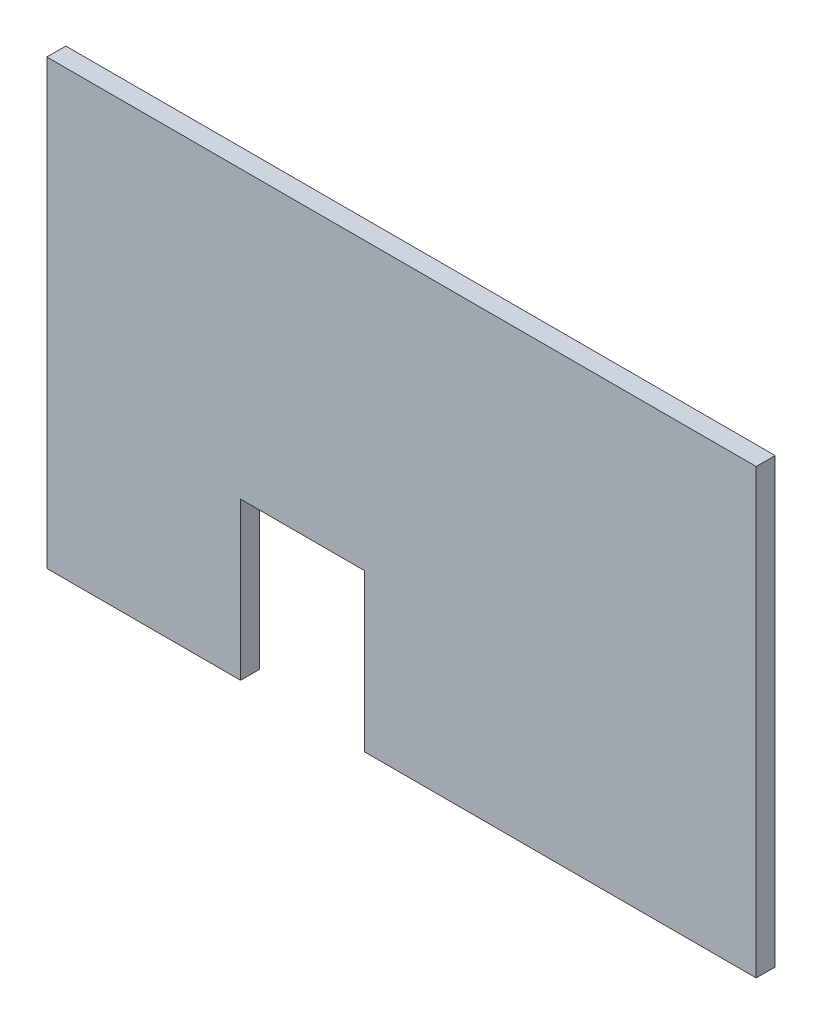
ISO-10303-21;
HEADER;
FILE_DESCRIPTION(('STEP AP214'),'2;1');
FILE_NAME('part.step','',(''),(''),'','','');
FILE_SCHEMA(('AUTOMOTIVE_DESIGN { 1 0 10303 214 1 1 1 1 }'));
ENDSEC;
DATA;
#1=APPLICATION_CONTEXT('core data for automotive mechanical design processes');
#2=APPLICATION_PROTOCOL_DEFINITION('international standard','automotive_design',2000,#1);
#3=PRODUCT_CONTEXT('',#1,'mechanical');
#4=PRODUCT('Part','Part','',(#3));
#5=PRODUCT_RELATED_PRODUCT_CATEGORY('part','',(#4));
#6=PRODUCT_DEFINITION_FORMATION('','',#4);
#7=PRODUCT_DEFINITION_CONTEXT('part definition',#1,'design');
#8=PRODUCT_DEFINITION('design','',#6,#7);
#9=PRODUCT_DEFINITION_SHAPE('','',#8);
#10=(LENGTH_UNIT() NAMED_UNIT(*) SI_UNIT(.MILLI.,.METRE.));
#11=(NAMED_UNIT(*) PLANE_ANGLE_UNIT() SI_UNIT($,.RADIAN.));
#12=(NAMED_UNIT(*) SI_UNIT($,.STERADIAN.) SOLID_ANGLE_UNIT());
#13=UNCERTAINTY_MEASURE_WITH_UNIT(LENGTH_MEASURE(1.E-05),#10,'distance_accuracy_value','');
#14=(GEOMETRIC_REPRESENTATION_CONTEXT(3) GLOBAL_UNCERTAINTY_ASSIGNED_CONTEXT((#13)) GLOBAL_UNIT_ASSIGNED_CONTEXT((#10,
#11,#12)) REPRESENTATION_CONTEXT('',''));
#15=CARTESIAN_POINT('',(0.,0.,0.));
#16=DIRECTION('',(0.,0.,1.));
#17=DIRECTION('',(1.,0.,0.));
#18=AXIS2_PLACEMENT_3D('',#15,#16,#17);
#19=CARTESIAN_POINT('',(67.55,35.,-153.));
#20=DIRECTION('',(-1.,0.,0.));
#21=DIRECTION('',(0.,0.,1.));
#22=AXIS2_PLACEMENT_3D('',#19,#20,#21);
#23=PLANE('',#22);
#24=DIRECTION('',(0.,-1.,0.));
#25=VECTOR('',#24,1.);
#26=CARTESIAN_POINT('',(67.55,35.,-150.));
#27=LINE('',#26,#25);
#28=CARTESIAN_POINT('',(67.55,35.,-150.));
#29=VERTEX_POINT('',#28);
#30=CARTESIAN_POINT('',(67.55,-35.,-150.));
#31=VERTEX_POINT('',#30);
#32=EDGE_CURVE('E129',#29,#31,#27,.T.);
#33=ORIENTED_EDGE('',*,*,#32,.T.);
#34=DIRECTION('',(0.,0.,1.));
#35=VECTOR('',#34,1.);
#36=CARTESIAN_POINT('',(67.55,-35.,-153.));
#37=LINE('',#36,#35);
#38=CARTESIAN_POINT('',(67.55,-35.,-153.));
#39=VERTEX_POINT('',#38);
#40=EDGE_CURVE('E11',#39,#31,#37,.T.);
#41=ORIENTED_EDGE('',*,*,#40,.F.);
#42=DIRECTION('',(0.,-1.,0.));
#43=VECTOR('',#42,1.);
#44=CARTESIAN_POINT('',(67.55,35.,-153.));
#45=LINE('',#44,#43);
#46=CARTESIAN_POINT('',(67.55,35.,-153.));
#47=VERTEX_POINT('',#46);
#48=EDGE_CURVE('E143',#47,#39,#45,.T.);
#49=ORIENTED_EDGE('',*,*,#48,.F.);
#50=DIRECTION('',(0.,0.,1.));
#51=VECTOR('',#50,1.);
#52=CARTESIAN_POINT('',(67.55,35.,-153.));
#53=LINE('',#52,#51);
#54=EDGE_CURVE('E125',#47,#29,#53,.T.);
#55=ORIENTED_EDGE('',*,*,#54,.T.);
#56=EDGE_LOOP('',(#33,#41,#49,#55));
#57=FACE_BOUND('',#56,.T.);
#58=ADVANCED_FACE('F33',(#57),#23,.F.);
#59=CARTESIAN_POINT('',(67.55,-35.,-153.));
#60=DIRECTION('',(0.,1.,0.));
#61=DIRECTION('',(0.,0.,1.));
#62=AXIS2_PLACEMENT_3D('',#59,#60,#61);
#63=PLANE('',#62);
#64=DIRECTION('',(-1.,0.,0.));
#65=VECTOR('',#64,1.);
#66=CARTESIAN_POINT('',(67.55,-35.,-150.));
#67=LINE('',#66,#65);
#68=CARTESIAN_POINT('',(5.67558189881321,-35.,-150.));
#69=VERTEX_POINT('',#68);
#70=EDGE_CURVE('E132',#31,#69,#67,.T.);
#71=ORIENTED_EDGE('',*,*,#70,.T.);
#72=DIRECTION('',(0.,0.,1.));
#73=VECTOR('',#72,1.);
#74=CARTESIAN_POINT('',(5.67558189881321,-35.,-153.));
#75=LINE('',#74,#73);
#76=CARTESIAN_POINT('',(5.67558189881321,-35.,-153.));
#77=VERTEX_POINT('',#76);
#78=EDGE_CURVE('E41',#77,#69,#75,.T.);
#79=ORIENTED_EDGE('',*,*,#78,.F.);
#80=DIRECTION('',(-1.,0.,0.));
#81=VECTOR('',#80,1.);
#82=CARTESIAN_POINT('',(67.55,-35.,-153.));
#83=LINE('',#82,#81);
#84=EDGE_CURVE('E92',#39,#77,#83,.T.);
#85=ORIENTED_EDGE('',*,*,#84,.F.);
#86=ORIENTED_EDGE('',*,*,#40,.T.);
#87=EDGE_LOOP('',(#71,#79,#85,#86));
#88=FACE_BOUND('',#87,.T.);
#89=ADVANCED_FACE('F178',(#88),#63,.F.);
#90=CARTESIAN_POINT('',(5.67558189881321,-10.2050948590735,-153.));
#91=DIRECTION('',(1.,0.,0.));
#92=DIRECTION('',(0.,0.,-1.));
#93=AXIS2_PLACEMENT_3D('',#90,#91,#92);
#94=PLANE('',#93);
#95=DIRECTION('',(0.,1.,0.));
#96=VECTOR('',#95,1.);
#97=CARTESIAN_POINT('',(5.67558189881321,-10.2050948590735,-150.));
#98=LINE('',#97,#96);
#99=CARTESIAN_POINT('',(5.67558189881321,-10.2050948590735,-150.));
#100=VERTEX_POINT('',#99);
#101=EDGE_CURVE('E134',#69,#100,#98,.T.);
#102=ORIENTED_EDGE('',*,*,#101,.T.);
#103=DIRECTION('',(0.,0.,1.));
#104=VECTOR('',#103,1.);
#105=CARTESIAN_POINT('',(5.67558189881321,-10.2050948590735,-153.));
#106=LINE('',#105,#104);
#107=CARTESIAN_POINT('',(5.67558189881321,-10.2050948590735,-153.));
#108=VERTEX_POINT('',#107);
#109=EDGE_CURVE('E150',#108,#100,#106,.T.);
#110=ORIENTED_EDGE('',*,*,#109,.F.);
#111=DIRECTION('',(0.,1.,0.));
#112=VECTOR('',#111,1.);
#113=CARTESIAN_POINT('',(5.67558189881321,-10.2050948590735,-153.));
#114=LINE('',#113,#112);
#115=EDGE_CURVE('E158',#77,#108,#114,.T.);
#116=ORIENTED_EDGE('',*,*,#115,.F.);
#117=ORIENTED_EDGE('',*,*,#78,.T.);
#118=EDGE_LOOP('',(#102,#110,#116,#117));
#119=FACE_BOUND('',#118,.T.);
#120=ADVANCED_FACE('F156',(#119),#94,.F.);
#121=CARTESIAN_POINT('',(5.67558189881321,-10.2050948590735,-153.));
#122=DIRECTION('',(0.,1.,0.));
#123=DIRECTION('',(0.,0.,1.));
#124=AXIS2_PLACEMENT_3D('',#121,#122,#123);
#125=PLANE('',#124);
#126=DIRECTION('',(-1.,0.,0.));
#127=VECTOR('',#126,1.);
#128=CARTESIAN_POINT('',(5.67558189881321,-10.2050948590735,-150.));
#129=LINE('',#128,#127);
#130=CARTESIAN_POINT('',(-13.9303153536338,-10.2050948590735,-150.));
#131=VERTEX_POINT('',#130);
#132=EDGE_CURVE('E136',#100,#131,#129,.T.);
#133=ORIENTED_EDGE('',*,*,#132,.T.);
#134=DIRECTION('',(0.,0.,1.));
#135=VECTOR('',#134,1.);
#136=CARTESIAN_POINT('',(-13.9303153536338,-10.2050948590735,-153.));
#137=LINE('',#136,#135);
#138=CARTESIAN_POINT('',(-13.9303153536338,-10.2050948590735,-153.));
#139=VERTEX_POINT('',#138);
#140=EDGE_CURVE('E147',#139,#131,#137,.T.);
#141=ORIENTED_EDGE('',*,*,#140,.F.);
#142=DIRECTION('',(-1.,0.,0.));
#143=VECTOR('',#142,1.);
#144=CARTESIAN_POINT('',(5.67558189881321,-10.2050948590735,-153.));
#145=LINE('',#144,#143);
#146=EDGE_CURVE('E170',#108,#139,#145,.T.);
#147=ORIENTED_EDGE('',*,*,#146,.F.);
#148=ORIENTED_EDGE('',*,*,#109,.T.);
#149=EDGE_LOOP('',(#133,#141,#147,#148));
#150=FACE_BOUND('',#149,.T.);
#151=ADVANCED_FACE('F166',(#150),#125,.F.);
#152=CARTESIAN_POINT('',(-13.9303153536338,-10.2050948590735,-153.));
#153=DIRECTION('',(-1.,0.,0.));
#154=DIRECTION('',(0.,0.,1.));
#155=AXIS2_PLACEMENT_3D('',#152,#153,#154);
#156=PLANE('',#155);
#157=DIRECTION('',(0.,-1.,0.));
#158=VECTOR('',#157,1.);
#159=CARTESIAN_POINT('',(-13.9303153536338,-10.2050948590735,-150.));
#160=LINE('',#159,#158);
#161=CARTESIAN_POINT('',(-13.9303153536338,-35.,-150.));
#162=VERTEX_POINT('',#161);
#163=EDGE_CURVE('E138',#131,#162,#160,.T.);
#164=ORIENTED_EDGE('',*,*,#163,.T.);
#165=DIRECTION('',(0.,0.,1.));
#166=VECTOR('',#165,1.);
#167=CARTESIAN_POINT('',(-13.9303153536338,-35.,-153.));
#168=LINE('',#167,#166);
#169=CARTESIAN_POINT('',(-13.9303153536338,-35.,-153.));
#170=VERTEX_POINT('',#169);
#171=EDGE_CURVE('E120',#170,#162,#168,.T.);
#172=ORIENTED_EDGE('',*,*,#171,.F.);
#173=DIRECTION('',(0.,-1.,0.));
#174=VECTOR('',#173,1.);
#175=CARTESIAN_POINT('',(-13.9303153536338,-10.2050948590735,-153.));
#176=LINE('',#175,#174);
#177=EDGE_CURVE('E111',#139,#170,#176,.T.);
#178=ORIENTED_EDGE('',*,*,#177,.F.);
#179=ORIENTED_EDGE('',*,*,#140,.T.);
#180=EDGE_LOOP('',(#164,#172,#178,#179));
#181=FACE_BOUND('',#180,.T.);
#182=ADVANCED_FACE('F169',(#181),#156,.F.);
#183=CARTESIAN_POINT('',(-13.9303153536338,-35.,-153.));
#184=DIRECTION('',(0.,1.,0.));
#185=DIRECTION('',(0.,0.,1.));
#186=AXIS2_PLACEMENT_3D('',#183,#184,#185);
#187=PLANE('',#186);
#188=DIRECTION('',(-1.,0.,0.));
#189=VECTOR('',#188,1.);
#190=CARTESIAN_POINT('',(-13.9303153536338,-35.,-150.));
#191=LINE('',#190,#189);
#192=CARTESIAN_POINT('',(-44.55,-35.,-150.));
#193=VERTEX_POINT('',#192);
#194=EDGE_CURVE('E119',#162,#193,#191,.T.);
#195=ORIENTED_EDGE('',*,*,#194,.T.);
#196=DIRECTION('',(0.,0.,1.));
#197=VECTOR('',#196,1.);
#198=CARTESIAN_POINT('',(-44.55,-35.,-153.));
#199=LINE('',#198,#197);
#200=CARTESIAN_POINT('',(-44.55,-35.,-153.));
#201=VERTEX_POINT('',#200);
#202=EDGE_CURVE('E116',#201,#193,#199,.T.);
#203=ORIENTED_EDGE('',*,*,#202,.F.);
#204=DIRECTION('',(-1.,0.,0.));
#205=VECTOR('',#204,1.);
#206=CARTESIAN_POINT('',(-13.9303153536338,-35.,-153.));
#207=LINE('',#206,#205);
#208=EDGE_CURVE('E105',#170,#201,#207,.T.);
#209=ORIENTED_EDGE('',*,*,#208,.F.);
#210=ORIENTED_EDGE('',*,*,#171,.T.);
#211=EDGE_LOOP('',(#195,#203,#209,#210));
#212=FACE_BOUND('',#211,.T.);
#213=ADVANCED_FACE('F117',(#212),#187,.F.);
#214=CARTESIAN_POINT('',(-44.55,35.,-153.));
#215=DIRECTION('',(1.,0.,0.));
#216=DIRECTION('',(0.,0.,-1.));
#217=AXIS2_PLACEMENT_3D('',#214,#215,#216);
#218=PLANE('',#217);
#219=DIRECTION('',(0.,1.,0.));
#220=VECTOR('',#219,1.);
#221=CARTESIAN_POINT('',(-44.55,35.,-150.));
#222=LINE('',#221,#220);
#223=CARTESIAN_POINT('',(-44.55,35.,-150.));
#224=VERTEX_POINT('',#223);
#225=EDGE_CURVE('E78',#193,#224,#222,.T.);
#226=ORIENTED_EDGE('',*,*,#225,.T.);
#227=DIRECTION('',(0.,0.,1.));
#228=VECTOR('',#227,1.);
#229=CARTESIAN_POINT('',(-44.55,35.,-153.));
#230=LINE('',#229,#228);
#231=CARTESIAN_POINT('',(-44.55,35.,-153.));
#232=VERTEX_POINT('',#231);
#233=EDGE_CURVE('E121',#232,#224,#230,.T.);
#234=ORIENTED_EDGE('',*,*,#233,.F.);
#235=DIRECTION('',(0.,1.,0.));
#236=VECTOR('',#235,1.);
#237=CARTESIAN_POINT('',(-44.55,35.,-153.));
#238=LINE('',#237,#236);
#239=EDGE_CURVE('E109',#201,#232,#238,.T.);
#240=ORIENTED_EDGE('',*,*,#239,.F.);
#241=ORIENTED_EDGE('',*,*,#202,.T.);
#242=EDGE_LOOP('',(#226,#234,#240,#241));
#243=FACE_BOUND('',#242,.T.);
#244=ADVANCED_FACE('F123',(#243),#218,.F.);
#245=CARTESIAN_POINT('',(67.55,35.,-153.));
#246=DIRECTION('',(0.,-1.,0.));
#247=DIRECTION('',(0.,0.,-1.));
#248=AXIS2_PLACEMENT_3D('',#245,#246,#247);
#249=PLANE('',#248);
#250=DIRECTION('',(1.,0.,0.));
#251=VECTOR('',#250,1.);
#252=CARTESIAN_POINT('',(67.55,35.,-150.));
#253=LINE('',#252,#251);
#254=EDGE_CURVE('E84',#224,#29,#253,.T.);
#255=ORIENTED_EDGE('',*,*,#254,.T.);
#256=ORIENTED_EDGE('',*,*,#54,.F.);
#257=DIRECTION('',(1.,0.,0.));
#258=VECTOR('',#257,1.);
#259=CARTESIAN_POINT('',(67.55,35.,-153.));
#260=LINE('',#259,#258);
#261=EDGE_CURVE('E49',#232,#47,#260,.T.);
#262=ORIENTED_EDGE('',*,*,#261,.F.);
#263=ORIENTED_EDGE('',*,*,#233,.T.);
#264=EDGE_LOOP('',(#255,#256,#262,#263));
#265=FACE_BOUND('',#264,.T.);
#266=ADVANCED_FACE('F194',(#265),#249,.F.);
#267=CARTESIAN_POINT('',(0.,0.,-153.));
#268=DIRECTION('',(0.,0.,-1.));
#269=DIRECTION('',(-1.,0.,0.));
#270=AXIS2_PLACEMENT_3D('',#267,#268,#269);
#271=PLANE('',#270);
#272=ORIENTED_EDGE('',*,*,#48,.T.);
#273=ORIENTED_EDGE('',*,*,#84,.T.);
#274=ORIENTED_EDGE('',*,*,#115,.T.);
#275=ORIENTED_EDGE('',*,*,#146,.T.);
#276=ORIENTED_EDGE('',*,*,#177,.T.);
#277=ORIENTED_EDGE('',*,*,#208,.T.);
#278=ORIENTED_EDGE('',*,*,#239,.T.);
#279=ORIENTED_EDGE('',*,*,#261,.T.);
#280=EDGE_LOOP('',(#272,#273,#274,#275,#276,#277,#278,#279));
#281=FACE_BOUND('',#280,.T.);
#282=ADVANCED_FACE('F107',(#281),#271,.T.);
#283=CARTESIAN_POINT('',(0.,0.,-150.));
#284=DIRECTION('',(0.,0.,-1.));
#285=DIRECTION('',(-1.,0.,0.));
#286=AXIS2_PLACEMENT_3D('',#283,#284,#285);
#287=PLANE('',#286);
#288=ORIENTED_EDGE('',*,*,#32,.F.);
#289=ORIENTED_EDGE('',*,*,#254,.F.);
#290=ORIENTED_EDGE('',*,*,#225,.F.);
#291=ORIENTED_EDGE('',*,*,#194,.F.);
#292=ORIENTED_EDGE('',*,*,#163,.F.);
#293=ORIENTED_EDGE('',*,*,#132,.F.);
#294=ORIENTED_EDGE('',*,*,#101,.F.);
#295=ORIENTED_EDGE('',*,*,#70,.F.);
#296=EDGE_LOOP('',(#288,#289,#290,#291,#292,#293,#294,#295));
#297=FACE_BOUND('',#296,.T.);
#298=ADVANCED_FACE('F162',(#297),#287,.F.);
#299=CLOSED_SHELL('',(#58,#89,#120,#151,#182,#213,#244,#266,#282,#298));
#300=MANIFOLD_SOLID_BREP('B2',#299);
#301=ADVANCED_BREP_SHAPE_REPRESENTATION('',(#18,#300),#14);
#302=SHAPE_DEFINITION_REPRESENTATION(#9,#301);
ENDSEC;
END-ISO-10303-21;
